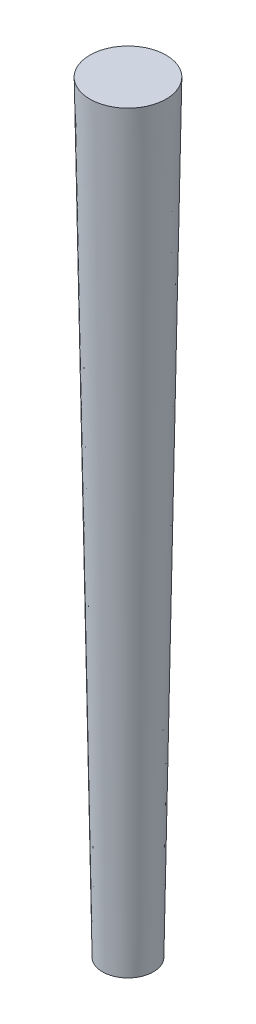
ISO-10303-21;
HEADER;
FILE_DESCRIPTION(('STEP AP214'),'2;1');
FILE_NAME('part.step','',(''),(''),'','','');
FILE_SCHEMA(('AUTOMOTIVE_DESIGN { 1 0 10303 214 1 1 1 1 }'));
ENDSEC;
DATA;
#1=APPLICATION_CONTEXT('core data for automotive mechanical design processes');
#2=APPLICATION_PROTOCOL_DEFINITION('international standard','automotive_design',2000,#1);
#3=PRODUCT_CONTEXT('',#1,'mechanical');
#4=PRODUCT('Part','Part','',(#3));
#5=PRODUCT_RELATED_PRODUCT_CATEGORY('part','',(#4));
#6=PRODUCT_DEFINITION_FORMATION('','',#4);
#7=PRODUCT_DEFINITION_CONTEXT('part definition',#1,'design');
#8=PRODUCT_DEFINITION('design','',#6,#7);
#9=PRODUCT_DEFINITION_SHAPE('','',#8);
#10=(LENGTH_UNIT() NAMED_UNIT(*) SI_UNIT(.MILLI.,.METRE.));
#11=(NAMED_UNIT(*) PLANE_ANGLE_UNIT() SI_UNIT($,.RADIAN.));
#12=(NAMED_UNIT(*) SI_UNIT($,.STERADIAN.) SOLID_ANGLE_UNIT());
#13=UNCERTAINTY_MEASURE_WITH_UNIT(LENGTH_MEASURE(1.E-05),#10,'distance_accuracy_value','');
#14=(GEOMETRIC_REPRESENTATION_CONTEXT(3) GLOBAL_UNCERTAINTY_ASSIGNED_CONTEXT((#13)) GLOBAL_UNIT_ASSIGNED_CONTEXT((#10,
#11,#12)) REPRESENTATION_CONTEXT('',''));
#15=CARTESIAN_POINT('',(0.,0.,0.));
#16=DIRECTION('',(0.,0.,1.));
#17=DIRECTION('',(1.,0.,0.));
#18=AXIS2_PLACEMENT_3D('',#15,#16,#17);
#19=CARTESIAN_POINT('',(0.,0.,0.));
#20=DIRECTION('',(0.,1.,0.));
#21=DIRECTION('',(-1.,0.,0.));
#22=AXIS2_PLACEMENT_3D('',#19,#20,#21);
#23=PLANE('',#22);
#24=CARTESIAN_POINT('',(0.,0.,0.));
#25=DIRECTION('',(0.,1.,0.));
#26=DIRECTION('',(-1.,0.,0.));
#27=AXIS2_PLACEMENT_3D('',#24,#25,#26);
#28=CIRCLE('',#27,2.);
#29=CARTESIAN_POINT('',(-2.,0.,0.));
#30=VERTEX_POINT('',#29);
#31=EDGE_CURVE('E10',#30,#30,#28,.T.);
#32=ORIENTED_EDGE('',*,*,#31,.F.);
#33=EDGE_LOOP('',(#32));
#34=FACE_BOUND('',#33,.T.);
#35=ADVANCED_FACE('F43',(#34),#23,.F.);
#36=CARTESIAN_POINT('',(0.,0.,0.));
#37=DIRECTION('',(0.,1.,0.));
#38=DIRECTION('',(-1.,0.,0.));
#39=AXIS2_PLACEMENT_3D('',#36,#37,#38);
#40=CONICAL_SURFACE('',#39,2.,0.0166651237139408);
#41=CARTESIAN_POINT('',(0.,60.,0.));
#42=DIRECTION('',(0.,1.,0.));
#43=DIRECTION('',(-1.,0.,0.));
#44=AXIS2_PLACEMENT_3D('',#41,#42,#43);
#45=CIRCLE('',#44,3.);
#46=CARTESIAN_POINT('',(-3.00000000000001,60.,0.));
#47=VERTEX_POINT('',#46);
#48=EDGE_CURVE('E50',#47,#47,#45,.T.);
#49=ORIENTED_EDGE('',*,*,#48,.F.);
#50=EDGE_LOOP('',(#49));
#51=FACE_BOUND('',#50,.T.);
#52=ORIENTED_EDGE('',*,*,#31,.T.);
#53=EDGE_LOOP('',(#52));
#54=FACE_BOUND('',#53,.T.);
#55=ADVANCED_FACE('F59',(#51,#54),#40,.T.);
#56=CARTESIAN_POINT('',(2.99999999999999,60.,0.));
#57=DIRECTION('',(0.,-1.,0.));
#58=DIRECTION('',(1.,0.,0.));
#59=AXIS2_PLACEMENT_3D('',#56,#57,#58);
#60=PLANE('',#59);
#61=ORIENTED_EDGE('',*,*,#48,.T.);
#62=EDGE_LOOP('',(#61));
#63=FACE_BOUND('',#62,.T.);
#64=ADVANCED_FACE('F57',(#63),#60,.F.);
#65=CLOSED_SHELL('',(#35,#55,#64));
#66=MANIFOLD_SOLID_BREP('B2',#65);
#67=ADVANCED_BREP_SHAPE_REPRESENTATION('',(#18,#66),#14);
#68=SHAPE_DEFINITION_REPRESENTATION(#9,#67);
ENDSEC;
END-ISO-10303-21;
